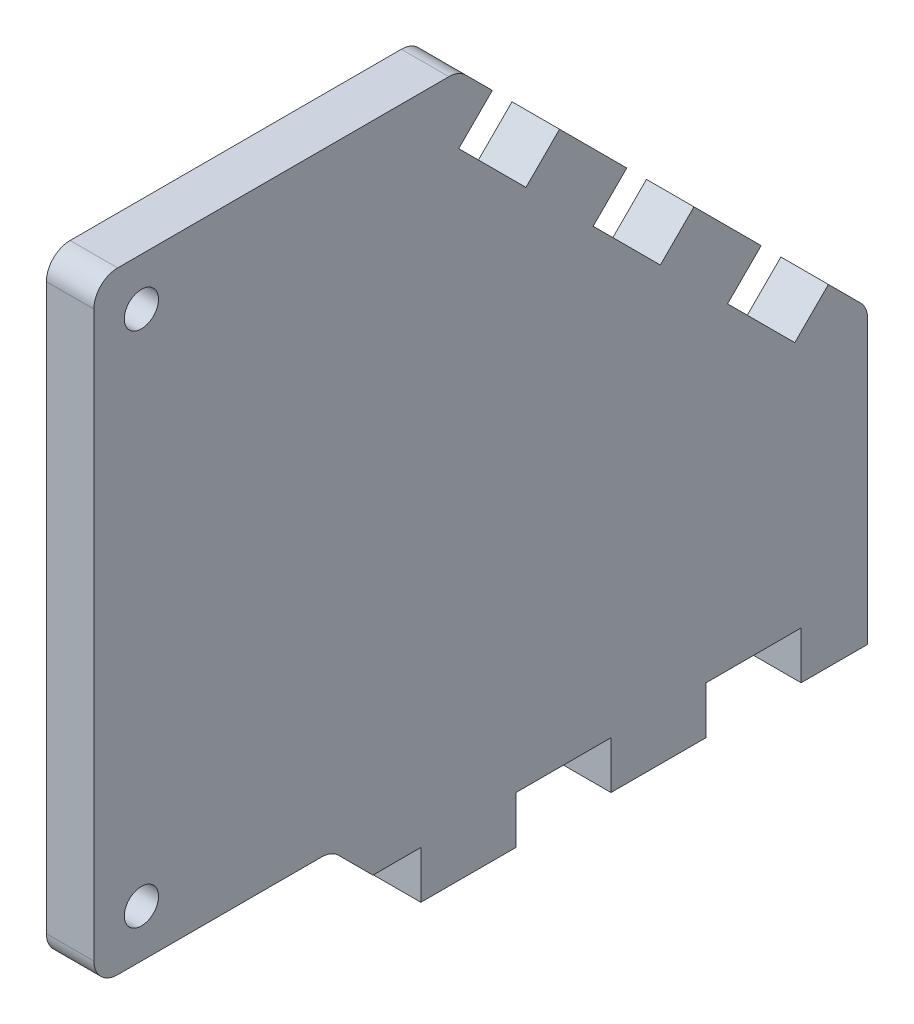
ISO-10303-21;
HEADER;
FILE_DESCRIPTION(('STEP AP214'),'2;1');
FILE_NAME('part.step','',(''),(''),'','','');
FILE_SCHEMA(('AUTOMOTIVE_DESIGN { 1 0 10303 214 1 1 1 1 }'));
ENDSEC;
DATA;
#1=APPLICATION_CONTEXT('core data for automotive mechanical design processes');
#2=APPLICATION_PROTOCOL_DEFINITION('international standard','automotive_design',2000,#1);
#3=PRODUCT_CONTEXT('',#1,'mechanical');
#4=PRODUCT('Part','Part','',(#3));
#5=PRODUCT_RELATED_PRODUCT_CATEGORY('part','',(#4));
#6=PRODUCT_DEFINITION_FORMATION('','',#4);
#7=PRODUCT_DEFINITION_CONTEXT('part definition',#1,'design');
#8=PRODUCT_DEFINITION('design','',#6,#7);
#9=PRODUCT_DEFINITION_SHAPE('','',#8);
#10=(LENGTH_UNIT() NAMED_UNIT(*) SI_UNIT(.MILLI.,.METRE.));
#11=(NAMED_UNIT(*) PLANE_ANGLE_UNIT() SI_UNIT($,.RADIAN.));
#12=(NAMED_UNIT(*) SI_UNIT($,.STERADIAN.) SOLID_ANGLE_UNIT());
#13=UNCERTAINTY_MEASURE_WITH_UNIT(LENGTH_MEASURE(1.E-05),#10,'distance_accuracy_value','');
#14=(GEOMETRIC_REPRESENTATION_CONTEXT(3) GLOBAL_UNCERTAINTY_ASSIGNED_CONTEXT((#13)) GLOBAL_UNIT_ASSIGNED_CONTEXT((#10,
#11,#12)) REPRESENTATION_CONTEXT('',''));
#15=CARTESIAN_POINT('',(0.,0.,0.));
#16=DIRECTION('',(0.,0.,1.));
#17=DIRECTION('',(1.,0.,0.));
#18=AXIS2_PLACEMENT_3D('',#15,#16,#17);
#19=CARTESIAN_POINT('',(6.35,41.2634086658808,-41.2634086658803));
#20=DIRECTION('',(0.,0.707106781186552,-0.707106781186543));
#21=DIRECTION('',(0.,0.707106781186543,0.707106781186552));
#22=AXIS2_PLACEMENT_3D('',#19,#20,#21);
#23=PLANE('',#22);
#24=DIRECTION('',(1.,0.,0.));
#25=VECTOR('',#24,1.);
#26=CARTESIAN_POINT('',(0.,88.1296158183963,5.60279848663597));
#27=LINE('',#26,#25);
#28=CARTESIAN_POINT('',(0.,88.1296158183963,5.60279848663597));
#29=VERTEX_POINT('',#28);
#30=CARTESIAN_POINT('',(6.35,88.1296158183963,5.60279848663597));
#31=VERTEX_POINT('',#30);
#32=EDGE_CURVE('E434',#29,#31,#27,.T.);
#33=ORIENTED_EDGE('',*,*,#32,.T.);
#34=DIRECTION('',(0.,-0.707106781186543,-0.707106781186552));
#35=VECTOR('',#34,1.);
#36=CARTESIAN_POINT('',(6.35,41.2634086658808,-41.2634086658803));
#37=LINE('',#36,#35);
#38=CARTESIAN_POINT('',(6.35,79.1493596973271,-3.37745763443318));
#39=VERTEX_POINT('',#38);
#40=EDGE_CURVE('E310',#31,#39,#37,.T.);
#41=ORIENTED_EDGE('',*,*,#40,.T.);
#42=DIRECTION('',(1.,0.,0.));
#43=VECTOR('',#42,1.);
#44=CARTESIAN_POINT('',(0.,79.1493596973271,-3.37745763443318));
#45=LINE('',#44,#43);
#46=CARTESIAN_POINT('',(0.,79.1493596973271,-3.37745763443318));
#47=VERTEX_POINT('',#46);
#48=EDGE_CURVE('E415',#47,#39,#45,.T.);
#49=ORIENTED_EDGE('',*,*,#48,.F.);
#50=DIRECTION('',(0.,-0.707106781186543,-0.707106781186552));
#51=VECTOR('',#50,1.);
#52=CARTESIAN_POINT('',(0.,41.2634086658808,-41.2634086658803));
#53=LINE('',#52,#51);
#54=EDGE_CURVE('E564',#29,#47,#53,.T.);
#55=ORIENTED_EDGE('',*,*,#54,.F.);
#56=EDGE_LOOP('',(#33,#41,#49,#55));
#57=FACE_BOUND('',#56,.T.);
#58=ADVANCED_FACE('F35',(#57),#23,.T.);
#59=DIRECTION('',(1.,0.,0.));
#60=VECTOR('',#59,1.);
#61=CARTESIAN_POINT('',(0.,70.169103576258,-12.3577137555023));
#62=LINE('',#61,#60);
#63=CARTESIAN_POINT('',(0.,70.169103576258,-12.3577137555023));
#64=VERTEX_POINT('',#63);
#65=CARTESIAN_POINT('',(6.35,70.169103576258,-12.3577137555023));
#66=VERTEX_POINT('',#65);
#67=EDGE_CURVE('E407',#64,#66,#62,.T.);
#68=ORIENTED_EDGE('',*,*,#67,.T.);
#69=CARTESIAN_POINT('',(6.35,61.1888474551889,-21.3379698765714));
#70=VERTEX_POINT('',#69);
#71=EDGE_CURVE('E613',#66,#70,#37,.T.);
#72=ORIENTED_EDGE('',*,*,#71,.T.);
#73=DIRECTION('',(1.,0.,0.));
#74=VECTOR('',#73,1.);
#75=CARTESIAN_POINT('',(0.,61.1888474551889,-21.3379698765714));
#76=LINE('',#75,#74);
#77=CARTESIAN_POINT('',(0.,61.1888474551889,-21.3379698765714));
#78=VERTEX_POINT('',#77);
#79=EDGE_CURVE('E388',#78,#70,#76,.T.);
#80=ORIENTED_EDGE('',*,*,#79,.F.);
#81=EDGE_CURVE('E631',#64,#78,#53,.T.);
#82=ORIENTED_EDGE('',*,*,#81,.F.);
#83=EDGE_LOOP('',(#68,#72,#80,#82));
#84=FACE_BOUND('',#83,.T.);
#85=ADVANCED_FACE('F589',(#84),#23,.T.);
#86=CARTESIAN_POINT('',(6.35,52.2085913341197,-30.3182259976406));
#87=VERTEX_POINT('',#86);
#88=CARTESIAN_POINT('',(6.35,47.8967533014937,-34.6300640302673));
#89=VERTEX_POINT('',#88);
#90=EDGE_CURVE('E311',#87,#89,#37,.T.);
#91=ORIENTED_EDGE('',*,*,#90,.T.);
#92=DIRECTION('',(1.,0.,0.));
#93=VECTOR('',#92,1.);
#94=CARTESIAN_POINT('',(0.,47.8967533014937,-34.6300640302673));
#95=LINE('',#94,#93);
#96=CARTESIAN_POINT('',(0.,47.8967533014937,-34.6300640302673));
#97=VERTEX_POINT('',#96);
#98=EDGE_CURVE('E477',#89,#97,#95,.F.);
#99=ORIENTED_EDGE('',*,*,#98,.T.);
#100=CARTESIAN_POINT('',(0.,52.2085913341197,-30.3182259976406));
#101=VERTEX_POINT('',#100);
#102=EDGE_CURVE('E566',#101,#97,#53,.T.);
#103=ORIENTED_EDGE('',*,*,#102,.F.);
#104=DIRECTION('',(1.,0.,0.));
#105=VECTOR('',#104,1.);
#106=CARTESIAN_POINT('',(0.,52.2085913341197,-30.3182259976406));
#107=LINE('',#106,#105);
#108=EDGE_CURVE('E380',#101,#87,#107,.T.);
#109=ORIENTED_EDGE('',*,*,#108,.T.);
#110=EDGE_LOOP('',(#91,#99,#103,#109));
#111=FACE_BOUND('',#110,.T.);
#112=ADVANCED_FACE('F596',(#111),#23,.T.);
#113=CARTESIAN_POINT('',(6.35,7.9375,0.));
#114=DIRECTION('',(0.,-1.,0.));
#115=DIRECTION('',(0.,0.,-1.));
#116=AXIS2_PLACEMENT_3D('',#113,#114,#115);
#117=PLANE('',#116);
#118=DIRECTION('',(1.,0.,0.));
#119=VECTOR('',#118,1.);
#120=CARTESIAN_POINT('',(0.,7.93750000000001,-13.97));
#121=LINE('',#120,#119);
#122=CARTESIAN_POINT('',(0.,7.93750000000001,-13.97));
#123=VERTEX_POINT('',#122);
#124=CARTESIAN_POINT('',(6.35,7.93750000000001,-13.97));
#125=VERTEX_POINT('',#124);
#126=EDGE_CURVE('E356',#123,#125,#121,.T.);
#127=ORIENTED_EDGE('',*,*,#126,.T.);
#128=DIRECTION('',(0.,0.,1.));
#129=VECTOR('',#128,1.);
#130=CARTESIAN_POINT('',(6.35,7.9375,0.));
#131=LINE('',#130,#129);
#132=CARTESIAN_POINT('',(6.35,7.93750000000001,-1.27000000000002));
#133=VERTEX_POINT('',#132);
#134=EDGE_CURVE('E282',#125,#133,#131,.T.);
#135=ORIENTED_EDGE('',*,*,#134,.T.);
#136=DIRECTION('',(1.,0.,0.));
#137=VECTOR('',#136,1.);
#138=CARTESIAN_POINT('',(0.,7.93750000000001,-1.27000000000002));
#139=LINE('',#138,#137);
#140=CARTESIAN_POINT('',(0.,7.93750000000001,-1.27000000000002));
#141=VERTEX_POINT('',#140);
#142=EDGE_CURVE('E333',#141,#133,#139,.T.);
#143=ORIENTED_EDGE('',*,*,#142,.F.);
#144=DIRECTION('',(0.,0.,1.));
#145=VECTOR('',#144,1.);
#146=CARTESIAN_POINT('',(0.,7.9375,0.));
#147=LINE('',#146,#145);
#148=EDGE_CURVE('E540',#123,#141,#147,.T.);
#149=ORIENTED_EDGE('',*,*,#148,.F.);
#150=EDGE_LOOP('',(#127,#135,#143,#149));
#151=FACE_BOUND('',#150,.T.);
#152=ADVANCED_FACE('F584',(#151),#117,.T.);
#153=DIRECTION('',(1.,0.,0.));
#154=VECTOR('',#153,1.);
#155=CARTESIAN_POINT('',(0.,7.9375,-35.56));
#156=LINE('',#155,#154);
#157=CARTESIAN_POINT('',(0.,7.93750000000001,-35.56));
#158=VERTEX_POINT('',#157);
#159=CARTESIAN_POINT('',(6.35,7.9375,-35.56));
#160=VERTEX_POINT('',#159);
#161=EDGE_CURVE('E260',#158,#160,#156,.T.);
#162=ORIENTED_EDGE('',*,*,#161,.T.);
#163=CARTESIAN_POINT('',(6.35,7.93750000000001,-26.67));
#164=VERTEX_POINT('',#163);
#165=EDGE_CURVE('E271',#160,#164,#131,.T.);
#166=ORIENTED_EDGE('',*,*,#165,.T.);
#167=DIRECTION('',(1.,0.,0.));
#168=VECTOR('',#167,1.);
#169=CARTESIAN_POINT('',(0.,7.93750000000001,-26.67));
#170=LINE('',#169,#168);
#171=CARTESIAN_POINT('',(0.,7.93750000000001,-26.67));
#172=VERTEX_POINT('',#171);
#173=EDGE_CURVE('E364',#172,#164,#170,.T.);
#174=ORIENTED_EDGE('',*,*,#173,.F.);
#175=EDGE_CURVE('E273',#158,#172,#147,.T.);
#176=ORIENTED_EDGE('',*,*,#175,.F.);
#177=EDGE_LOOP('',(#162,#166,#174,#176));
#178=FACE_BOUND('',#177,.T.);
#179=ADVANCED_FACE('F269',(#178),#117,.T.);
#180=CARTESIAN_POINT('',(0.,100.670064030267,18.143246698507));
#181=VERTEX_POINT('',#180);
#182=CARTESIAN_POINT('',(0.,97.1098719394654,14.5830546077051));
#183=VERTEX_POINT('',#182);
#184=EDGE_CURVE('E561',#181,#183,#53,.T.);
#185=ORIENTED_EDGE('',*,*,#184,.F.);
#186=DIRECTION('',(-1.,0.,0.));
#187=VECTOR('',#186,1.);
#188=CARTESIAN_POINT('',(6.35,100.670064030267,18.143246698507));
#189=LINE('',#188,#187);
#190=CARTESIAN_POINT('',(6.35,100.670064030267,18.143246698507));
#191=VERTEX_POINT('',#190);
#192=EDGE_CURVE('E497',#181,#191,#189,.F.);
#193=ORIENTED_EDGE('',*,*,#192,.T.);
#194=CARTESIAN_POINT('',(6.35,97.1098719394654,14.5830546077051));
#195=VERTEX_POINT('',#194);
#196=EDGE_CURVE('E308',#191,#195,#37,.T.);
#197=ORIENTED_EDGE('',*,*,#196,.T.);
#198=DIRECTION('',(1.,0.,0.));
#199=VECTOR('',#198,1.);
#200=CARTESIAN_POINT('',(0.,97.1098719394654,14.5830546077051));
#201=LINE('',#200,#199);
#202=EDGE_CURVE('E442',#183,#195,#201,.T.);
#203=ORIENTED_EDGE('',*,*,#202,.F.);
#204=EDGE_LOOP('',(#185,#193,#197,#203));
#205=FACE_BOUND('',#204,.T.);
#206=ADVANCED_FACE('F592',(#205),#23,.T.);
#207=CARTESIAN_POINT('',(6.35,101.6,0.));
#208=DIRECTION('',(0.,1.,0.));
#209=DIRECTION('',(0.,0.,1.));
#210=AXIS2_PLACEMENT_3D('',#207,#208,#209);
#211=PLANE('',#210);
#212=DIRECTION('',(0.,0.,-1.));
#213=VECTOR('',#212,1.);
#214=CARTESIAN_POINT('',(6.35,101.6,0.));
#215=LINE('',#214,#213);
#216=CARTESIAN_POINT('',(6.35,101.6,64.643));
#217=VERTEX_POINT('',#216);
#218=CARTESIAN_POINT('',(6.35,101.6,20.3883107287743));
#219=VERTEX_POINT('',#218);
#220=EDGE_CURVE('E305',#217,#219,#215,.T.);
#221=ORIENTED_EDGE('',*,*,#220,.T.);
#222=DIRECTION('',(-1.,0.,0.));
#223=VECTOR('',#222,1.);
#224=CARTESIAN_POINT('',(6.35,101.6,20.3883107287743));
#225=LINE('',#224,#223);
#226=CARTESIAN_POINT('',(0.,101.6,20.3883107287743));
#227=VERTEX_POINT('',#226);
#228=EDGE_CURVE('E495',#219,#227,#225,.T.);
#229=ORIENTED_EDGE('',*,*,#228,.T.);
#230=DIRECTION('',(0.,0.,-1.));
#231=VECTOR('',#230,1.);
#232=CARTESIAN_POINT('',(0.,101.6,0.));
#233=LINE('',#232,#231);
#234=CARTESIAN_POINT('',(0.,101.6,64.643));
#235=VERTEX_POINT('',#234);
#236=EDGE_CURVE('E558',#235,#227,#233,.T.);
#237=ORIENTED_EDGE('',*,*,#236,.F.);
#238=DIRECTION('',(-1.,0.,0.));
#239=VECTOR('',#238,1.);
#240=CARTESIAN_POINT('',(6.35,101.6,64.643));
#241=LINE('',#240,#239);
#242=EDGE_CURVE('E493',#235,#217,#241,.F.);
#243=ORIENTED_EDGE('',*,*,#242,.T.);
#244=EDGE_LOOP('',(#221,#229,#237,#243));
#245=FACE_BOUND('',#244,.T.);
#246=ADVANCED_FACE('F560',(#245),#211,.T.);
#247=CARTESIAN_POINT('',(6.35,0.,67.818));
#248=DIRECTION('',(0.,0.,-1.));
#249=DIRECTION('',(0.,1.,0.));
#250=AXIS2_PLACEMENT_3D('',#247,#248,#249);
#251=PLANE('',#250);
#252=DIRECTION('',(0.,-1.,0.));
#253=VECTOR('',#252,1.);
#254=CARTESIAN_POINT('',(6.35,0.,67.818));
#255=LINE('',#254,#253);
#256=CARTESIAN_POINT('',(6.35,98.425,67.818));
#257=VERTEX_POINT('',#256);
#258=CARTESIAN_POINT('',(6.35,22.987,67.818));
#259=VERTEX_POINT('',#258);
#260=EDGE_CURVE('E300',#257,#259,#255,.T.);
#261=ORIENTED_EDGE('',*,*,#260,.F.);
#262=DIRECTION('',(-1.,0.,0.));
#263=VECTOR('',#262,1.);
#264=CARTESIAN_POINT('',(0.,98.425,67.818));
#265=LINE('',#264,#263);
#266=CARTESIAN_POINT('',(0.,98.425,67.818));
#267=VERTEX_POINT('',#266);
#268=EDGE_CURVE('E509',#257,#267,#265,.T.);
#269=ORIENTED_EDGE('',*,*,#268,.T.);
#270=DIRECTION('',(0.,-1.,0.));
#271=VECTOR('',#270,1.);
#272=CARTESIAN_POINT('',(0.,0.,67.818));
#273=LINE('',#272,#271);
#274=CARTESIAN_POINT('',(0.,22.987,67.818));
#275=VERTEX_POINT('',#274);
#276=EDGE_CURVE('E523',#267,#275,#273,.T.);
#277=ORIENTED_EDGE('',*,*,#276,.T.);
#278=DIRECTION('',(-1.,0.,0.));
#279=VECTOR('',#278,1.);
#280=CARTESIAN_POINT('',(6.35,22.987,67.818));
#281=LINE('',#280,#279);
#282=EDGE_CURVE('E507',#275,#259,#281,.F.);
#283=ORIENTED_EDGE('',*,*,#282,.T.);
#284=EDGE_LOOP('',(#261,#269,#277,#283));
#285=FACE_BOUND('',#284,.T.);
#286=ADVANCED_FACE('F552',(#285),#251,.F.);
#287=CARTESIAN_POINT('',(6.35,19.812,0.));
#288=DIRECTION('',(0.,1.,0.));
#289=DIRECTION('',(0.,0.,1.));
#290=AXIS2_PLACEMENT_3D('',#287,#288,#289);
#291=PLANE('',#290);
#292=DIRECTION('',(0.,0.,-1.));
#293=VECTOR('',#292,1.);
#294=CARTESIAN_POINT('',(0.,19.812,0.));
#295=LINE('',#294,#293);
#296=CARTESIAN_POINT('',(0.,19.812,64.643));
#297=VERTEX_POINT('',#296);
#298=CARTESIAN_POINT('',(0.,19.812,37.3831280605345));
#299=VERTEX_POINT('',#298);
#300=EDGE_CURVE('E514',#297,#299,#295,.T.);
#301=ORIENTED_EDGE('',*,*,#300,.T.);
#302=DIRECTION('',(-1.,0.,0.));
#303=VECTOR('',#302,1.);
#304=CARTESIAN_POINT('',(6.35,19.812,37.3831280605345));
#305=LINE('',#304,#303);
#306=CARTESIAN_POINT('',(6.35,19.812,37.3831280605345));
#307=VERTEX_POINT('',#306);
#308=EDGE_CURVE('E505',#299,#307,#305,.F.);
#309=ORIENTED_EDGE('',*,*,#308,.T.);
#310=DIRECTION('',(0.,0.,-1.));
#311=VECTOR('',#310,1.);
#312=CARTESIAN_POINT('',(6.35,19.812,0.));
#313=LINE('',#312,#311);
#314=CARTESIAN_POINT('',(6.35,19.812,64.643));
#315=VERTEX_POINT('',#314);
#316=EDGE_CURVE('E295',#315,#307,#313,.T.);
#317=ORIENTED_EDGE('',*,*,#316,.F.);
#318=DIRECTION('',(-1.,0.,0.));
#319=VECTOR('',#318,1.);
#320=CARTESIAN_POINT('',(6.35,19.812,64.643));
#321=LINE('',#320,#319);
#322=EDGE_CURVE('E502',#315,#297,#321,.T.);
#323=ORIENTED_EDGE('',*,*,#322,.T.);
#324=EDGE_LOOP('',(#301,#309,#317,#323));
#325=FACE_BOUND('',#324,.T.);
#326=ADVANCED_FACE('F520',(#325),#291,.F.);
#327=CARTESIAN_POINT('',(6.35,-8.12799999999986,8.12799999999976));
#328=DIRECTION('',(0.,0.707106781186552,-0.707106781186543));
#329=DIRECTION('',(0.,0.707106781186543,0.707106781186552));
#330=AXIS2_PLACEMENT_3D('',#327,#328,#329);
#331=PLANE('',#330);
#332=DIRECTION('',(0.,-0.707106781186543,-0.707106781186552));
#333=VECTOR('',#332,1.);
#334=CARTESIAN_POINT('',(6.35,-8.12799999999986,8.12799999999976));
#335=LINE('',#334,#333);
#336=CARTESIAN_POINT('',(6.35,18.8820640302673,35.1380640302673));
#337=VERTEX_POINT('',#336);
#338=CARTESIAN_POINT('',(6.35,14.2874999999999,30.5434999999998));
#339=VERTEX_POINT('',#338);
#340=EDGE_CURVE('E289',#337,#339,#335,.T.);
#341=ORIENTED_EDGE('',*,*,#340,.F.);
#342=DIRECTION('',(-1.,0.,0.));
#343=VECTOR('',#342,1.);
#344=CARTESIAN_POINT('',(0.,18.8820640302673,35.1380640302673));
#345=LINE('',#344,#343);
#346=CARTESIAN_POINT('',(0.,18.8820640302673,35.1380640302673));
#347=VERTEX_POINT('',#346);
#348=EDGE_CURVE('E499',#337,#347,#345,.T.);
#349=ORIENTED_EDGE('',*,*,#348,.T.);
#350=DIRECTION('',(0.,-0.707106781186543,-0.707106781186552));
#351=VECTOR('',#350,1.);
#352=CARTESIAN_POINT('',(0.,-8.12799999999986,8.12799999999976));
#353=LINE('',#352,#351);
#354=CARTESIAN_POINT('',(0.,14.2874999999999,30.5434999999998));
#355=VERTEX_POINT('',#354);
#356=EDGE_CURVE('E515',#347,#355,#353,.T.);
#357=ORIENTED_EDGE('',*,*,#356,.T.);
#358=DIRECTION('',(1.,0.,0.));
#359=VECTOR('',#358,1.);
#360=CARTESIAN_POINT('',(6.35,14.2874999999999,30.5434999999998));
#361=LINE('',#360,#359);
#362=EDGE_CURVE('E318',#355,#339,#361,.T.);
#363=ORIENTED_EDGE('',*,*,#362,.T.);
#364=EDGE_LOOP('',(#341,#349,#357,#363));
#365=FACE_BOUND('',#364,.T.);
#366=ADVANCED_FACE('F528',(#365),#331,.F.);
#367=CARTESIAN_POINT('',(6.35,95.25,61.468));
#368=DIRECTION('',(-1.,0.,0.));
#369=DIRECTION('',(0.,0.,1.));
#370=AXIS2_PLACEMENT_3D('',#367,#368,#369);
#371=CYLINDRICAL_SURFACE('',#370,2.28599999999999);
#372=CARTESIAN_POINT('',(6.35,95.25,61.468));
#373=DIRECTION('',(1.,0.,0.));
#374=DIRECTION('',(0.,0.,-1.));
#375=AXIS2_PLACEMENT_3D('',#372,#373,#374);
#376=CIRCLE('',#375,2.28599999999999);
#377=CARTESIAN_POINT('',(6.35,95.25,59.182));
#378=VERTEX_POINT('',#377);
#379=EDGE_CURVE('E312',#378,#378,#376,.T.);
#380=ORIENTED_EDGE('',*,*,#379,.T.);
#381=EDGE_LOOP('',(#380));
#382=FACE_BOUND('',#381,.T.);
#383=CARTESIAN_POINT('',(0.,95.25,61.468));
#384=DIRECTION('',(1.,0.,0.));
#385=DIRECTION('',(0.,0.,-1.));
#386=AXIS2_PLACEMENT_3D('',#383,#384,#385);
#387=CIRCLE('',#386,2.28599999999999);
#388=CARTESIAN_POINT('',(0.,95.25,59.182));
#389=VERTEX_POINT('',#388);
#390=EDGE_CURVE('E568',#389,#389,#387,.T.);
#391=ORIENTED_EDGE('',*,*,#390,.F.);
#392=EDGE_LOOP('',(#391));
#393=FACE_BOUND('',#392,.T.);
#394=ADVANCED_FACE('F576',(#382,#393),#371,.F.);
#395=CARTESIAN_POINT('',(6.35,26.162,61.468));
#396=DIRECTION('',(-1.,0.,0.));
#397=DIRECTION('',(0.,0.,1.));
#398=AXIS2_PLACEMENT_3D('',#395,#396,#397);
#399=CYLINDRICAL_SURFACE('',#398,2.28599999999999);
#400=CARTESIAN_POINT('',(6.35,26.162,61.468));
#401=DIRECTION('',(1.,0.,0.));
#402=DIRECTION('',(0.,0.,-1.));
#403=AXIS2_PLACEMENT_3D('',#400,#401,#402);
#404=CIRCLE('',#403,2.28599999999999);
#405=CARTESIAN_POINT('',(6.35,26.162,59.182));
#406=VERTEX_POINT('',#405);
#407=EDGE_CURVE('E315',#406,#406,#404,.T.);
#408=ORIENTED_EDGE('',*,*,#407,.T.);
#409=EDGE_LOOP('',(#408));
#410=FACE_BOUND('',#409,.T.);
#411=CARTESIAN_POINT('',(0.,26.162,61.468));
#412=DIRECTION('',(1.,0.,0.));
#413=DIRECTION('',(0.,0.,-1.));
#414=AXIS2_PLACEMENT_3D('',#411,#412,#413);
#415=CIRCLE('',#414,2.28599999999999);
#416=CARTESIAN_POINT('',(0.,26.162,59.182));
#417=VERTEX_POINT('',#416);
#418=EDGE_CURVE('E321',#417,#417,#415,.T.);
#419=ORIENTED_EDGE('',*,*,#418,.F.);
#420=EDGE_LOOP('',(#419));
#421=FACE_BOUND('',#420,.T.);
#422=ADVANCED_FACE('F574',(#410,#421),#399,.F.);
#423=DIRECTION('',(1.,0.,0.));
#424=VECTOR('',#423,1.);
#425=CARTESIAN_POINT('',(0.,7.93750000000001,11.43));
#426=LINE('',#425,#424);
#427=CARTESIAN_POINT('',(0.,7.93750000000001,11.43));
#428=VERTEX_POINT('',#427);
#429=CARTESIAN_POINT('',(6.35,7.93750000000001,11.43));
#430=VERTEX_POINT('',#429);
#431=EDGE_CURVE('E343',#428,#430,#426,.T.);
#432=ORIENTED_EDGE('',*,*,#431,.T.);
#433=CARTESIAN_POINT('',(6.35,7.93750000000001,24.13));
#434=VERTEX_POINT('',#433);
#435=EDGE_CURVE('E284',#430,#434,#131,.T.);
#436=ORIENTED_EDGE('',*,*,#435,.T.);
#437=DIRECTION('',(1.,0.,0.));
#438=VECTOR('',#437,1.);
#439=CARTESIAN_POINT('',(0.,7.93750000000001,24.13));
#440=LINE('',#439,#438);
#441=CARTESIAN_POINT('',(0.,7.93750000000001,24.13));
#442=VERTEX_POINT('',#441);
#443=EDGE_CURVE('E323',#442,#434,#440,.T.);
#444=ORIENTED_EDGE('',*,*,#443,.F.);
#445=EDGE_CURVE('E535',#428,#442,#147,.T.);
#446=ORIENTED_EDGE('',*,*,#445,.F.);
#447=EDGE_LOOP('',(#432,#436,#444,#446));
#448=FACE_BOUND('',#447,.T.);
#449=ADVANCED_FACE('F539',(#448),#117,.T.);
#450=CARTESIAN_POINT('',(6.35,0.,0.));
#451=DIRECTION('',(1.,0.,0.));
#452=DIRECTION('',(0.,0.,-1.));
#453=AXIS2_PLACEMENT_3D('',#450,#451,#452);
#454=PLANE('',#453);
#455=DIRECTION('',(0.,-1.,0.));
#456=VECTOR('',#455,1.);
#457=CARTESIAN_POINT('',(6.35,7.9375,-35.56));
#458=LINE('',#457,#456);
#459=CARTESIAN_POINT('',(6.35,45.6516892712264,-35.56));
#460=VERTEX_POINT('',#459);
#461=EDGE_CURVE('E256',#460,#160,#458,.T.);
#462=ORIENTED_EDGE('',*,*,#461,.F.);
#463=CARTESIAN_POINT('',(6.35,45.6516892712264,-32.385));
#464=DIRECTION('',(1.,0.,0.));
#465=DIRECTION('',(0.,0.,-1.));
#466=AXIS2_PLACEMENT_3D('',#463,#464,#465);
#467=CIRCLE('',#466,3.175);
#468=EDGE_CURVE('E476',#460,#89,#467,.T.);
#469=ORIENTED_EDGE('',*,*,#468,.T.);
#470=ORIENTED_EDGE('',*,*,#90,.F.);
#471=DIRECTION('',(0.,0.707106781186548,-0.707106781186548));
#472=VECTOR('',#471,1.);
#473=CARTESIAN_POINT('',(6.35,52.2085913341197,-30.3182259976406));
#474=LINE('',#473,#472);
#475=CARTESIAN_POINT('',(6.35,47.7184632735851,-25.828097937106));
#476=VERTEX_POINT('',#475);
#477=EDGE_CURVE('E398',#476,#87,#474,.T.);
#478=ORIENTED_EDGE('',*,*,#477,.F.);
#479=DIRECTION('',(0.,-0.707106781186548,-0.707106781186547));
#480=VECTOR('',#479,1.);
#481=CARTESIAN_POINT('',(6.35,47.7184632735851,-25.828097937106));
#482=LINE('',#481,#480);
#483=CARTESIAN_POINT('',(6.35,56.6987193946543,-16.8478418160368));
#484=VERTEX_POINT('',#483);
#485=EDGE_CURVE('E401',#484,#476,#482,.T.);
#486=ORIENTED_EDGE('',*,*,#485,.F.);
#487=DIRECTION('',(0.,-0.707106781186548,0.707106781186547));
#488=VECTOR('',#487,1.);
#489=CARTESIAN_POINT('',(6.35,56.6987193946543,-16.8478418160368));
#490=LINE('',#489,#488);
#491=EDGE_CURVE('E404',#70,#484,#490,.T.);
#492=ORIENTED_EDGE('',*,*,#491,.F.);
#493=ORIENTED_EDGE('',*,*,#71,.F.);
#494=DIRECTION('',(0.,0.707106781186548,-0.707106781186548));
#495=VECTOR('',#494,1.);
#496=CARTESIAN_POINT('',(6.35,70.169103576258,-12.3577137555023));
#497=LINE('',#496,#495);
#498=CARTESIAN_POINT('',(6.35,65.6789755157234,-7.86758569496774));
#499=VERTEX_POINT('',#498);
#500=EDGE_CURVE('E425',#499,#66,#497,.T.);
#501=ORIENTED_EDGE('',*,*,#500,.F.);
#502=DIRECTION('',(0.,-0.707106781186547,-0.707106781186548));
#503=VECTOR('',#502,1.);
#504=CARTESIAN_POINT('',(6.35,65.6789755157234,-7.86758569496774));
#505=LINE('',#504,#503);
#506=CARTESIAN_POINT('',(6.35,74.6592316367925,1.11267042610141));
#507=VERTEX_POINT('',#506);
#508=EDGE_CURVE('E428',#507,#499,#505,.T.);
#509=ORIENTED_EDGE('',*,*,#508,.F.);
#510=DIRECTION('',(0.,-0.707106781186547,0.707106781186548));
#511=VECTOR('',#510,1.);
#512=CARTESIAN_POINT('',(6.35,74.6592316367925,1.11267042610141));
#513=LINE('',#512,#511);
#514=EDGE_CURVE('E431',#39,#507,#513,.T.);
#515=ORIENTED_EDGE('',*,*,#514,.F.);
#516=ORIENTED_EDGE('',*,*,#40,.F.);
#517=DIRECTION('',(0.,0.707106781186548,-0.707106781186547));
#518=VECTOR('',#517,1.);
#519=CARTESIAN_POINT('',(6.35,88.1296158183963,5.60279848663597));
#520=LINE('',#519,#518);
#521=CARTESIAN_POINT('',(6.35,83.6394877578617,10.0929265471706));
#522=VERTEX_POINT('',#521);
#523=EDGE_CURVE('E452',#522,#31,#520,.T.);
#524=ORIENTED_EDGE('',*,*,#523,.F.);
#525=DIRECTION('',(0.,-0.707106781186548,-0.707106781186547));
#526=VECTOR('',#525,1.);
#527=CARTESIAN_POINT('',(6.35,83.6394877578617,10.0929265471706));
#528=LINE('',#527,#526);
#529=CARTESIAN_POINT('',(6.35,92.6197438789308,19.0731826682397));
#530=VERTEX_POINT('',#529);
#531=EDGE_CURVE('E455',#530,#522,#528,.T.);
#532=ORIENTED_EDGE('',*,*,#531,.F.);
#533=DIRECTION('',(0.,-0.707106781186546,0.707106781186549));
#534=VECTOR('',#533,1.);
#535=CARTESIAN_POINT('',(6.35,92.6197438789308,19.0731826682397));
#536=LINE('',#535,#534);
#537=EDGE_CURVE('E274',#195,#530,#536,.T.);
#538=ORIENTED_EDGE('',*,*,#537,.F.);
#539=ORIENTED_EDGE('',*,*,#196,.F.);
#540=CARTESIAN_POINT('',(6.35,98.425,20.3883107287743));
#541=DIRECTION('',(1.,0.,0.));
#542=DIRECTION('',(0.,0.,-1.));
#543=AXIS2_PLACEMENT_3D('',#540,#541,#542);
#544=CIRCLE('',#543,3.175);
#545=EDGE_CURVE('E480',#191,#219,#544,.T.);
#546=ORIENTED_EDGE('',*,*,#545,.T.);
#547=ORIENTED_EDGE('',*,*,#220,.F.);
#548=CARTESIAN_POINT('',(6.35,98.425,64.643));
#549=DIRECTION('',(1.,0.,0.));
#550=DIRECTION('',(0.,0.,-1.));
#551=AXIS2_PLACEMENT_3D('',#548,#549,#550);
#552=CIRCLE('',#551,3.175);
#553=EDGE_CURVE('E484',#217,#257,#552,.T.);
#554=ORIENTED_EDGE('',*,*,#553,.T.);
#555=ORIENTED_EDGE('',*,*,#260,.T.);
#556=CARTESIAN_POINT('',(6.35,22.987,64.643));
#557=DIRECTION('',(1.,0.,0.));
#558=DIRECTION('',(0.,0.,-1.));
#559=AXIS2_PLACEMENT_3D('',#556,#557,#558);
#560=CIRCLE('',#559,3.175);
#561=EDGE_CURVE('E285',#259,#315,#560,.T.);
#562=ORIENTED_EDGE('',*,*,#561,.T.);
#563=ORIENTED_EDGE('',*,*,#316,.T.);
#564=CARTESIAN_POINT('',(6.35,16.637,37.3831280605345));
#565=DIRECTION('',(1.,0.,0.));
#566=DIRECTION('',(0.,0.,-1.));
#567=AXIS2_PLACEMENT_3D('',#564,#565,#566);
#568=CIRCLE('',#567,3.175);
#569=EDGE_CURVE('E11',#307,#337,#568,.F.);
#570=ORIENTED_EDGE('',*,*,#569,.T.);
#571=ORIENTED_EDGE('',*,*,#340,.T.);
#572=DIRECTION('',(0.,0.,1.));
#573=VECTOR('',#572,1.);
#574=CARTESIAN_POINT('',(6.35,14.2874999999999,36.83));
#575=LINE('',#574,#573);
#576=CARTESIAN_POINT('',(6.35,14.2874999999999,24.13));
#577=VERTEX_POINT('',#576);
#578=EDGE_CURVE('E327',#577,#339,#575,.T.);
#579=ORIENTED_EDGE('',*,*,#578,.F.);
#580=DIRECTION('',(0.,1.,0.));
#581=VECTOR('',#580,1.);
#582=CARTESIAN_POINT('',(6.35,14.2874999999999,24.13));
#583=LINE('',#582,#581);
#584=EDGE_CURVE('E330',#434,#577,#583,.T.);
#585=ORIENTED_EDGE('',*,*,#584,.F.);
#586=ORIENTED_EDGE('',*,*,#435,.F.);
#587=DIRECTION('',(0.,-1.,0.));
#588=VECTOR('',#587,1.);
#589=CARTESIAN_POINT('',(6.35,7.93750000000001,11.43));
#590=LINE('',#589,#588);
#591=CARTESIAN_POINT('',(6.35,14.2875,11.43));
#592=VERTEX_POINT('',#591);
#593=EDGE_CURVE('E347',#592,#430,#590,.T.);
#594=ORIENTED_EDGE('',*,*,#593,.F.);
#595=DIRECTION('',(0.,0.,1.));
#596=VECTOR('',#595,1.);
#597=CARTESIAN_POINT('',(6.35,14.2875,11.43));
#598=LINE('',#597,#596);
#599=CARTESIAN_POINT('',(6.35,14.2875,-1.27000000000002));
#600=VERTEX_POINT('',#599);
#601=EDGE_CURVE('E350',#600,#592,#598,.T.);
#602=ORIENTED_EDGE('',*,*,#601,.F.);
#603=DIRECTION('',(0.,1.,0.));
#604=VECTOR('',#603,1.);
#605=CARTESIAN_POINT('',(6.35,14.2875,-1.27000000000002));
#606=LINE('',#605,#604);
#607=EDGE_CURVE('E353',#133,#600,#606,.T.);
#608=ORIENTED_EDGE('',*,*,#607,.F.);
#609=ORIENTED_EDGE('',*,*,#134,.F.);
#610=DIRECTION('',(0.,-1.,0.));
#611=VECTOR('',#610,1.);
#612=CARTESIAN_POINT('',(6.35,7.93750000000001,-13.97));
#613=LINE('',#612,#611);
#614=CARTESIAN_POINT('',(6.35,14.2875,-13.97));
#615=VERTEX_POINT('',#614);
#616=EDGE_CURVE('E373',#615,#125,#613,.T.);
#617=ORIENTED_EDGE('',*,*,#616,.F.);
#618=DIRECTION('',(0.,0.,1.));
#619=VECTOR('',#618,1.);
#620=CARTESIAN_POINT('',(6.35,14.2875,-13.97));
#621=LINE('',#620,#619);
#622=CARTESIAN_POINT('',(6.35,14.2875,-26.67));
#623=VERTEX_POINT('',#622);
#624=EDGE_CURVE('E376',#623,#615,#621,.T.);
#625=ORIENTED_EDGE('',*,*,#624,.F.);
#626=DIRECTION('',(0.,1.,0.));
#627=VECTOR('',#626,1.);
#628=CARTESIAN_POINT('',(6.35,14.2875,-26.67));
#629=LINE('',#628,#627);
#630=EDGE_CURVE('E281',#164,#623,#629,.T.);
#631=ORIENTED_EDGE('',*,*,#630,.F.);
#632=ORIENTED_EDGE('',*,*,#165,.F.);
#633=EDGE_LOOP('',(#462,#469,#470,#478,#486,#492,#493,#501,#509,#515,#516,#524,#532,#538,#539,
#546,#547,#554,#555,#562,#563,#570,#571,#579,#585,#586,#594,#602,#608,#609,#617,#625,#631,#632));
#634=FACE_BOUND('',#633,.T.);
#635=ORIENTED_EDGE('',*,*,#407,.F.);
#636=EDGE_LOOP('',(#635));
#637=FACE_BOUND('',#636,.T.);
#638=ORIENTED_EDGE('',*,*,#379,.F.);
#639=EDGE_LOOP('',(#638));
#640=FACE_BOUND('',#639,.T.);
#641=ADVANCED_FACE('F277',(#634,#637,#640),#454,.T.);
#642=CARTESIAN_POINT('',(0.,0.,0.));
#643=DIRECTION('',(1.,0.,0.));
#644=DIRECTION('',(0.,0.,-1.));
#645=AXIS2_PLACEMENT_3D('',#642,#643,#644);
#646=PLANE('',#645);
#647=ORIENTED_EDGE('',*,*,#102,.T.);
#648=CARTESIAN_POINT('',(0.,45.6516892712264,-32.385));
#649=DIRECTION('',(1.,0.,0.));
#650=DIRECTION('',(0.,0.,-1.));
#651=AXIS2_PLACEMENT_3D('',#648,#649,#650);
#652=CIRCLE('',#651,3.175);
#653=CARTESIAN_POINT('',(0.,45.6516892712264,-35.56));
#654=VERTEX_POINT('',#653);
#655=EDGE_CURVE('E472',#97,#654,#652,.F.);
#656=ORIENTED_EDGE('',*,*,#655,.T.);
#657=DIRECTION('',(0.,-1.,0.));
#658=VECTOR('',#657,1.);
#659=CARTESIAN_POINT('',(0.,7.9375,-35.56));
#660=LINE('',#659,#658);
#661=EDGE_CURVE('E266',#654,#158,#660,.T.);
#662=ORIENTED_EDGE('',*,*,#661,.T.);
#663=ORIENTED_EDGE('',*,*,#175,.T.);
#664=DIRECTION('',(0.,1.,0.));
#665=VECTOR('',#664,1.);
#666=CARTESIAN_POINT('',(0.,14.2875,-26.67));
#667=LINE('',#666,#665);
#668=CARTESIAN_POINT('',(0.,14.2875,-26.67));
#669=VERTEX_POINT('',#668);
#670=EDGE_CURVE('E375',#172,#669,#667,.T.);
#671=ORIENTED_EDGE('',*,*,#670,.T.);
#672=DIRECTION('',(0.,0.,1.));
#673=VECTOR('',#672,1.);
#674=CARTESIAN_POINT('',(0.,14.2875,-13.97));
#675=LINE('',#674,#673);
#676=CARTESIAN_POINT('',(0.,14.2875,-13.97));
#677=VERTEX_POINT('',#676);
#678=EDGE_CURVE('E383',#669,#677,#675,.T.);
#679=ORIENTED_EDGE('',*,*,#678,.T.);
#680=DIRECTION('',(0.,-1.,0.));
#681=VECTOR('',#680,1.);
#682=CARTESIAN_POINT('',(0.,7.93750000000001,-13.97));
#683=LINE('',#682,#681);
#684=EDGE_CURVE('E367',#677,#123,#683,.T.);
#685=ORIENTED_EDGE('',*,*,#684,.T.);
#686=ORIENTED_EDGE('',*,*,#148,.T.);
#687=DIRECTION('',(0.,1.,0.));
#688=VECTOR('',#687,1.);
#689=CARTESIAN_POINT('',(0.,14.2875,-1.27000000000002));
#690=LINE('',#689,#688);
#691=CARTESIAN_POINT('',(0.,14.2875,-1.27000000000002));
#692=VERTEX_POINT('',#691);
#693=EDGE_CURVE('E349',#141,#692,#690,.T.);
#694=ORIENTED_EDGE('',*,*,#693,.T.);
#695=DIRECTION('',(0.,0.,1.));
#696=VECTOR('',#695,1.);
#697=CARTESIAN_POINT('',(0.,14.2875,11.43));
#698=LINE('',#697,#696);
#699=CARTESIAN_POINT('',(0.,14.2875,11.43));
#700=VERTEX_POINT('',#699);
#701=EDGE_CURVE('E359',#692,#700,#698,.T.);
#702=ORIENTED_EDGE('',*,*,#701,.T.);
#703=DIRECTION('',(0.,-1.,0.));
#704=VECTOR('',#703,1.);
#705=CARTESIAN_POINT('',(0.,7.93750000000001,11.43));
#706=LINE('',#705,#704);
#707=EDGE_CURVE('E341',#700,#428,#706,.T.);
#708=ORIENTED_EDGE('',*,*,#707,.T.);
#709=ORIENTED_EDGE('',*,*,#445,.T.);
#710=DIRECTION('',(0.,1.,0.));
#711=VECTOR('',#710,1.);
#712=CARTESIAN_POINT('',(0.,14.2874999999999,24.13));
#713=LINE('',#712,#711);
#714=CARTESIAN_POINT('',(0.,14.2874999999999,24.13));
#715=VERTEX_POINT('',#714);
#716=EDGE_CURVE('E329',#442,#715,#713,.T.);
#717=ORIENTED_EDGE('',*,*,#716,.T.);
#718=DIRECTION('',(0.,0.,1.));
#719=VECTOR('',#718,1.);
#720=CARTESIAN_POINT('',(0.,14.2874999999999,36.83));
#721=LINE('',#720,#719);
#722=EDGE_CURVE('E325',#715,#355,#721,.T.);
#723=ORIENTED_EDGE('',*,*,#722,.T.);
#724=ORIENTED_EDGE('',*,*,#356,.F.);
#725=CARTESIAN_POINT('',(0.,16.637,37.3831280605345));
#726=DIRECTION('',(1.,0.,0.));
#727=DIRECTION('',(0.,0.,-1.));
#728=AXIS2_PLACEMENT_3D('',#725,#726,#727);
#729=CIRCLE('',#728,3.175);
#730=EDGE_CURVE('E43',#347,#299,#729,.T.);
#731=ORIENTED_EDGE('',*,*,#730,.T.);
#732=ORIENTED_EDGE('',*,*,#300,.F.);
#733=CARTESIAN_POINT('',(0.,22.987,64.643));
#734=DIRECTION('',(1.,0.,0.));
#735=DIRECTION('',(0.,0.,-1.));
#736=AXIS2_PLACEMENT_3D('',#733,#734,#735);
#737=CIRCLE('',#736,3.175);
#738=EDGE_CURVE('E482',#297,#275,#737,.F.);
#739=ORIENTED_EDGE('',*,*,#738,.T.);
#740=ORIENTED_EDGE('',*,*,#276,.F.);
#741=CARTESIAN_POINT('',(0.,98.425,64.643));
#742=DIRECTION('',(1.,0.,0.));
#743=DIRECTION('',(0.,0.,-1.));
#744=AXIS2_PLACEMENT_3D('',#741,#742,#743);
#745=CIRCLE('',#744,3.175);
#746=EDGE_CURVE('E489',#267,#235,#745,.F.);
#747=ORIENTED_EDGE('',*,*,#746,.T.);
#748=ORIENTED_EDGE('',*,*,#236,.T.);
#749=CARTESIAN_POINT('',(0.,98.425,20.3883107287743));
#750=DIRECTION('',(1.,0.,0.));
#751=DIRECTION('',(0.,0.,-1.));
#752=AXIS2_PLACEMENT_3D('',#749,#750,#751);
#753=CIRCLE('',#752,3.175);
#754=EDGE_CURVE('E50',#227,#181,#753,.F.);
#755=ORIENTED_EDGE('',*,*,#754,.T.);
#756=ORIENTED_EDGE('',*,*,#184,.T.);
#757=DIRECTION('',(0.,-0.707106781186546,0.707106781186549));
#758=VECTOR('',#757,1.);
#759=CARTESIAN_POINT('',(0.,92.6197438789308,19.0731826682397));
#760=LINE('',#759,#758);
#761=CARTESIAN_POINT('',(0.,92.6197438789308,19.0731826682397));
#762=VERTEX_POINT('',#761);
#763=EDGE_CURVE('E454',#183,#762,#760,.T.);
#764=ORIENTED_EDGE('',*,*,#763,.T.);
#765=DIRECTION('',(0.,-0.707106781186548,-0.707106781186547));
#766=VECTOR('',#765,1.);
#767=CARTESIAN_POINT('',(0.,83.6394877578617,10.0929265471706));
#768=LINE('',#767,#766);
#769=CARTESIAN_POINT('',(0.,83.6394877578617,10.0929265471706));
#770=VERTEX_POINT('',#769);
#771=EDGE_CURVE('E462',#762,#770,#768,.T.);
#772=ORIENTED_EDGE('',*,*,#771,.T.);
#773=DIRECTION('',(0.,0.707106781186548,-0.707106781186547));
#774=VECTOR('',#773,1.);
#775=CARTESIAN_POINT('',(0.,88.1296158183963,5.60279848663597));
#776=LINE('',#775,#774);
#777=EDGE_CURVE('E446',#770,#29,#776,.T.);
#778=ORIENTED_EDGE('',*,*,#777,.T.);
#779=ORIENTED_EDGE('',*,*,#54,.T.);
#780=DIRECTION('',(0.,-0.707106781186547,0.707106781186548));
#781=VECTOR('',#780,1.);
#782=CARTESIAN_POINT('',(0.,74.6592316367925,1.11267042610141));
#783=LINE('',#782,#781);
#784=CARTESIAN_POINT('',(0.,74.6592316367925,1.1126704261014));
#785=VERTEX_POINT('',#784);
#786=EDGE_CURVE('E427',#47,#785,#783,.T.);
#787=ORIENTED_EDGE('',*,*,#786,.T.);
#788=DIRECTION('',(0.,-0.707106781186547,-0.707106781186548));
#789=VECTOR('',#788,1.);
#790=CARTESIAN_POINT('',(0.,65.6789755157234,-7.86758569496774));
#791=LINE('',#790,#789);
#792=CARTESIAN_POINT('',(0.,65.6789755157234,-7.86758569496774));
#793=VERTEX_POINT('',#792);
#794=EDGE_CURVE('E437',#785,#793,#791,.T.);
#795=ORIENTED_EDGE('',*,*,#794,.T.);
#796=DIRECTION('',(0.,0.707106781186548,-0.707106781186548));
#797=VECTOR('',#796,1.);
#798=CARTESIAN_POINT('',(0.,70.169103576258,-12.3577137555023));
#799=LINE('',#798,#797);
#800=EDGE_CURVE('E419',#793,#64,#799,.T.);
#801=ORIENTED_EDGE('',*,*,#800,.T.);
#802=ORIENTED_EDGE('',*,*,#81,.T.);
#803=DIRECTION('',(0.,-0.707106781186548,0.707106781186547));
#804=VECTOR('',#803,1.);
#805=CARTESIAN_POINT('',(0.,56.6987193946543,-16.8478418160368));
#806=LINE('',#805,#804);
#807=CARTESIAN_POINT('',(0.,56.6987193946543,-16.8478418160368));
#808=VERTEX_POINT('',#807);
#809=EDGE_CURVE('E400',#78,#808,#806,.T.);
#810=ORIENTED_EDGE('',*,*,#809,.T.);
#811=DIRECTION('',(0.,-0.707106781186548,-0.707106781186547));
#812=VECTOR('',#811,1.);
#813=CARTESIAN_POINT('',(0.,47.7184632735851,-25.828097937106));
#814=LINE('',#813,#812);
#815=CARTESIAN_POINT('',(0.,47.7184632735851,-25.828097937106));
#816=VERTEX_POINT('',#815);
#817=EDGE_CURVE('E410',#808,#816,#814,.T.);
#818=ORIENTED_EDGE('',*,*,#817,.T.);
#819=DIRECTION('',(0.,0.707106781186548,-0.707106781186548));
#820=VECTOR('',#819,1.);
#821=CARTESIAN_POINT('',(0.,52.2085913341197,-30.3182259976406));
#822=LINE('',#821,#820);
#823=EDGE_CURVE('E392',#816,#101,#822,.T.);
#824=ORIENTED_EDGE('',*,*,#823,.T.);
#825=EDGE_LOOP('',(#647,#656,#662,#663,#671,#679,#685,#686,#694,#702,#708,#709,#717,#723,#724,
#731,#732,#739,#740,#747,#748,#755,#756,#764,#772,#778,#779,#787,#795,#801,#802,#810,#818,#824));
#826=FACE_BOUND('',#825,.T.);
#827=ORIENTED_EDGE('',*,*,#418,.T.);
#828=EDGE_LOOP('',(#827));
#829=FACE_BOUND('',#828,.T.);
#830=ORIENTED_EDGE('',*,*,#390,.T.);
#831=EDGE_LOOP('',(#830));
#832=FACE_BOUND('',#831,.T.);
#833=ADVANCED_FACE('F468',(#826,#829,#832),#646,.F.);
#834=CARTESIAN_POINT('',(0.,14.2874999999999,36.83));
#835=DIRECTION('',(0.,1.,0.));
#836=DIRECTION('',(0.,0.,1.));
#837=AXIS2_PLACEMENT_3D('',#834,#835,#836);
#838=PLANE('',#837);
#839=ORIENTED_EDGE('',*,*,#722,.F.);
#840=DIRECTION('',(1.,0.,0.));
#841=VECTOR('',#840,1.);
#842=CARTESIAN_POINT('',(0.,14.2874999999999,24.13));
#843=LINE('',#842,#841);
#844=EDGE_CURVE('E322',#715,#577,#843,.T.);
#845=ORIENTED_EDGE('',*,*,#844,.T.);
#846=ORIENTED_EDGE('',*,*,#578,.T.);
#847=ORIENTED_EDGE('',*,*,#362,.F.);
#848=EDGE_LOOP('',(#839,#845,#846,#847));
#849=FACE_BOUND('',#848,.T.);
#850=ADVANCED_FACE('F531',(#849),#838,.F.);
#851=CARTESIAN_POINT('',(0.,14.2874999999999,24.13));
#852=DIRECTION('',(0.,0.,-1.));
#853=DIRECTION('',(-1.,0.,0.));
#854=AXIS2_PLACEMENT_3D('',#851,#852,#853);
#855=PLANE('',#854);
#856=ORIENTED_EDGE('',*,*,#584,.T.);
#857=ORIENTED_EDGE('',*,*,#844,.F.);
#858=ORIENTED_EDGE('',*,*,#716,.F.);
#859=ORIENTED_EDGE('',*,*,#443,.T.);
#860=EDGE_LOOP('',(#856,#857,#858,#859));
#861=FACE_BOUND('',#860,.T.);
#862=ADVANCED_FACE('F537',(#861),#855,.F.);
#863=CARTESIAN_POINT('',(0.,14.2875,-1.27000000000002));
#864=DIRECTION('',(0.,0.,-1.));
#865=DIRECTION('',(0.,1.,0.));
#866=AXIS2_PLACEMENT_3D('',#863,#864,#865);
#867=PLANE('',#866);
#868=ORIENTED_EDGE('',*,*,#607,.T.);
#869=DIRECTION('',(1.,0.,0.));
#870=VECTOR('',#869,1.);
#871=CARTESIAN_POINT('',(0.,14.2875,-1.27000000000002));
#872=LINE('',#871,#870);
#873=EDGE_CURVE('E338',#692,#600,#872,.T.);
#874=ORIENTED_EDGE('',*,*,#873,.F.);
#875=ORIENTED_EDGE('',*,*,#693,.F.);
#876=ORIENTED_EDGE('',*,*,#142,.T.);
#877=EDGE_LOOP('',(#868,#874,#875,#876));
#878=FACE_BOUND('',#877,.T.);
#879=ADVANCED_FACE('F681',(#878),#867,.F.);
#880=CARTESIAN_POINT('',(0.,7.93750000000001,11.43));
#881=DIRECTION('',(0.,0.,1.));
#882=DIRECTION('',(1.,0.,0.));
#883=AXIS2_PLACEMENT_3D('',#880,#881,#882);
#884=PLANE('',#883);
#885=ORIENTED_EDGE('',*,*,#593,.T.);
#886=ORIENTED_EDGE('',*,*,#431,.F.);
#887=ORIENTED_EDGE('',*,*,#707,.F.);
#888=DIRECTION('',(1.,0.,0.));
#889=VECTOR('',#888,1.);
#890=CARTESIAN_POINT('',(0.,14.2875,11.43));
#891=LINE('',#890,#889);
#892=EDGE_CURVE('E340',#700,#592,#891,.T.);
#893=ORIENTED_EDGE('',*,*,#892,.T.);
#894=EDGE_LOOP('',(#885,#886,#887,#893));
#895=FACE_BOUND('',#894,.T.);
#896=ADVANCED_FACE('F678',(#895),#884,.F.);
#897=CARTESIAN_POINT('',(0.,14.2875,11.43));
#898=DIRECTION('',(0.,1.,0.));
#899=DIRECTION('',(0.,0.,1.));
#900=AXIS2_PLACEMENT_3D('',#897,#898,#899);
#901=PLANE('',#900);
#902=ORIENTED_EDGE('',*,*,#601,.T.);
#903=ORIENTED_EDGE('',*,*,#892,.F.);
#904=ORIENTED_EDGE('',*,*,#701,.F.);
#905=ORIENTED_EDGE('',*,*,#873,.T.);
#906=EDGE_LOOP('',(#902,#903,#904,#905));
#907=FACE_BOUND('',#906,.T.);
#908=ADVANCED_FACE('F670',(#907),#901,.F.);
#909=CARTESIAN_POINT('',(0.,7.93750000000001,-13.97));
#910=DIRECTION('',(0.,0.,1.));
#911=DIRECTION('',(1.,0.,0.));
#912=AXIS2_PLACEMENT_3D('',#909,#910,#911);
#913=PLANE('',#912);
#914=ORIENTED_EDGE('',*,*,#616,.T.);
#915=ORIENTED_EDGE('',*,*,#126,.F.);
#916=ORIENTED_EDGE('',*,*,#684,.F.);
#917=DIRECTION('',(1.,0.,0.));
#918=VECTOR('',#917,1.);
#919=CARTESIAN_POINT('',(0.,14.2875,-13.97));
#920=LINE('',#919,#918);
#921=EDGE_CURVE('E369',#677,#615,#920,.T.);
#922=ORIENTED_EDGE('',*,*,#921,.T.);
#923=EDGE_LOOP('',(#914,#915,#916,#922));
#924=FACE_BOUND('',#923,.T.);
#925=ADVANCED_FACE('F666',(#924),#913,.F.);
#926=CARTESIAN_POINT('',(0.,14.2875,-13.97));
#927=DIRECTION('',(0.,1.,0.));
#928=DIRECTION('',(0.,0.,1.));
#929=AXIS2_PLACEMENT_3D('',#926,#927,#928);
#930=PLANE('',#929);
#931=ORIENTED_EDGE('',*,*,#624,.T.);
#932=ORIENTED_EDGE('',*,*,#921,.F.);
#933=ORIENTED_EDGE('',*,*,#678,.F.);
#934=DIRECTION('',(1.,0.,0.));
#935=VECTOR('',#934,1.);
#936=CARTESIAN_POINT('',(0.,14.2875,-26.67));
#937=LINE('',#936,#935);
#938=EDGE_CURVE('E366',#669,#623,#937,.T.);
#939=ORIENTED_EDGE('',*,*,#938,.T.);
#940=EDGE_LOOP('',(#931,#932,#933,#939));
#941=FACE_BOUND('',#940,.T.);
#942=ADVANCED_FACE('F669',(#941),#930,.F.);
#943=CARTESIAN_POINT('',(0.,14.2875,-26.67));
#944=DIRECTION('',(0.,0.,-1.));
#945=DIRECTION('',(0.,1.,0.));
#946=AXIS2_PLACEMENT_3D('',#943,#944,#945);
#947=PLANE('',#946);
#948=ORIENTED_EDGE('',*,*,#630,.T.);
#949=ORIENTED_EDGE('',*,*,#938,.F.);
#950=ORIENTED_EDGE('',*,*,#670,.F.);
#951=ORIENTED_EDGE('',*,*,#173,.T.);
#952=EDGE_LOOP('',(#948,#949,#950,#951));
#953=FACE_BOUND('',#952,.T.);
#954=ADVANCED_FACE('F663',(#953),#947,.F.);
#955=CARTESIAN_POINT('',(0.,52.2085913341197,-30.3182259976406));
#956=DIRECTION('',(0.,-0.707106781186548,-0.707106781186548));
#957=DIRECTION('',(0.,0.707106781186548,-0.707106781186548));
#958=AXIS2_PLACEMENT_3D('',#955,#956,#957);
#959=PLANE('',#958);
#960=ORIENTED_EDGE('',*,*,#477,.T.);
#961=ORIENTED_EDGE('',*,*,#108,.F.);
#962=ORIENTED_EDGE('',*,*,#823,.F.);
#963=DIRECTION('',(1.,0.,0.));
#964=VECTOR('',#963,1.);
#965=CARTESIAN_POINT('',(0.,47.7184632735851,-25.828097937106));
#966=LINE('',#965,#964);
#967=EDGE_CURVE('E394',#816,#476,#966,.T.);
#968=ORIENTED_EDGE('',*,*,#967,.T.);
#969=EDGE_LOOP('',(#960,#961,#962,#968));
#970=FACE_BOUND('',#969,.T.);
#971=ADVANCED_FACE('F636',(#970),#959,.F.);
#972=CARTESIAN_POINT('',(0.,47.7184632735851,-25.828097937106));
#973=DIRECTION('',(0.,-0.707106781186547,0.707106781186548));
#974=DIRECTION('',(0.,-0.707106781186548,-0.707106781186547));
#975=AXIS2_PLACEMENT_3D('',#972,#973,#974);
#976=PLANE('',#975);
#977=ORIENTED_EDGE('',*,*,#485,.T.);
#978=ORIENTED_EDGE('',*,*,#967,.F.);
#979=ORIENTED_EDGE('',*,*,#817,.F.);
#980=DIRECTION('',(1.,0.,0.));
#981=VECTOR('',#980,1.);
#982=CARTESIAN_POINT('',(0.,56.6987193946543,-16.8478418160368));
#983=LINE('',#982,#981);
#984=EDGE_CURVE('E391',#808,#484,#983,.T.);
#985=ORIENTED_EDGE('',*,*,#984,.T.);
#986=EDGE_LOOP('',(#977,#978,#979,#985));
#987=FACE_BOUND('',#986,.T.);
#988=ADVANCED_FACE('F640',(#987),#976,.F.);
#989=CARTESIAN_POINT('',(0.,56.6987193946543,-16.8478418160368));
#990=DIRECTION('',(0.,0.707106781186547,0.707106781186548));
#991=DIRECTION('',(0.,-0.707106781186548,0.707106781186547));
#992=AXIS2_PLACEMENT_3D('',#989,#990,#991);
#993=PLANE('',#992);
#994=ORIENTED_EDGE('',*,*,#491,.T.);
#995=ORIENTED_EDGE('',*,*,#984,.F.);
#996=ORIENTED_EDGE('',*,*,#809,.F.);
#997=ORIENTED_EDGE('',*,*,#79,.T.);
#998=EDGE_LOOP('',(#994,#995,#996,#997));
#999=FACE_BOUND('',#998,.T.);
#1000=ADVANCED_FACE('F643',(#999),#993,.F.);
#1001=CARTESIAN_POINT('',(0.,70.169103576258,-12.3577137555023));
#1002=DIRECTION('',(0.,-0.707106781186548,-0.707106781186548));
#1003=DIRECTION('',(0.,0.707106781186548,-0.707106781186548));
#1004=AXIS2_PLACEMENT_3D('',#1001,#1002,#1003);
#1005=PLANE('',#1004);
#1006=ORIENTED_EDGE('',*,*,#500,.T.);
#1007=ORIENTED_EDGE('',*,*,#67,.F.);
#1008=ORIENTED_EDGE('',*,*,#800,.F.);
#1009=DIRECTION('',(1.,0.,0.));
#1010=VECTOR('',#1009,1.);
#1011=CARTESIAN_POINT('',(0.,65.6789755157234,-7.86758569496774));
#1012=LINE('',#1011,#1010);
#1013=EDGE_CURVE('E421',#793,#499,#1012,.T.);
#1014=ORIENTED_EDGE('',*,*,#1013,.T.);
#1015=EDGE_LOOP('',(#1006,#1007,#1008,#1014));
#1016=FACE_BOUND('',#1015,.T.);
#1017=ADVANCED_FACE('F645',(#1016),#1005,.F.);
#1018=CARTESIAN_POINT('',(0.,65.6789755157234,-7.86758569496774));
#1019=DIRECTION('',(0.,-0.707106781186548,0.707106781186547));
#1020=DIRECTION('',(0.,-0.707106781186547,-0.707106781186548));
#1021=AXIS2_PLACEMENT_3D('',#1018,#1019,#1020);
#1022=PLANE('',#1021);
#1023=ORIENTED_EDGE('',*,*,#508,.T.);
#1024=ORIENTED_EDGE('',*,*,#1013,.F.);
#1025=ORIENTED_EDGE('',*,*,#794,.F.);
#1026=DIRECTION('',(1.,0.,0.));
#1027=VECTOR('',#1026,1.);
#1028=CARTESIAN_POINT('',(0.,74.6592316367925,1.11267042610141));
#1029=LINE('',#1028,#1027);
#1030=EDGE_CURVE('E418',#785,#507,#1029,.T.);
#1031=ORIENTED_EDGE('',*,*,#1030,.T.);
#1032=EDGE_LOOP('',(#1023,#1024,#1025,#1031));
#1033=FACE_BOUND('',#1032,.T.);
#1034=ADVANCED_FACE('F628',(#1033),#1022,.F.);
#1035=CARTESIAN_POINT('',(0.,74.6592316367925,1.11267042610141));
#1036=DIRECTION('',(0.,0.707106781186548,0.707106781186547));
#1037=DIRECTION('',(0.,-0.707106781186547,0.707106781186548));
#1038=AXIS2_PLACEMENT_3D('',#1035,#1036,#1037);
#1039=PLANE('',#1038);
#1040=ORIENTED_EDGE('',*,*,#514,.T.);
#1041=ORIENTED_EDGE('',*,*,#1030,.F.);
#1042=ORIENTED_EDGE('',*,*,#786,.F.);
#1043=ORIENTED_EDGE('',*,*,#48,.T.);
#1044=EDGE_LOOP('',(#1040,#1041,#1042,#1043));
#1045=FACE_BOUND('',#1044,.T.);
#1046=ADVANCED_FACE('F623',(#1045),#1039,.F.);
#1047=CARTESIAN_POINT('',(0.,88.1296158183963,5.60279848663597));
#1048=DIRECTION('',(0.,-0.707106781186547,-0.707106781186548));
#1049=DIRECTION('',(0.,0.707106781186548,-0.707106781186547));
#1050=AXIS2_PLACEMENT_3D('',#1047,#1048,#1049);
#1051=PLANE('',#1050);
#1052=ORIENTED_EDGE('',*,*,#523,.T.);
#1053=ORIENTED_EDGE('',*,*,#32,.F.);
#1054=ORIENTED_EDGE('',*,*,#777,.F.);
#1055=DIRECTION('',(1.,0.,0.));
#1056=VECTOR('',#1055,1.);
#1057=CARTESIAN_POINT('',(0.,83.6394877578617,10.0929265471706));
#1058=LINE('',#1057,#1056);
#1059=EDGE_CURVE('E448',#770,#522,#1058,.T.);
#1060=ORIENTED_EDGE('',*,*,#1059,.T.);
#1061=EDGE_LOOP('',(#1052,#1053,#1054,#1060));
#1062=FACE_BOUND('',#1061,.T.);
#1063=ADVANCED_FACE('F660',(#1062),#1051,.F.);
#1064=CARTESIAN_POINT('',(0.,83.6394877578617,10.0929265471706));
#1065=DIRECTION('',(0.,-0.707106781186547,0.707106781186548));
#1066=DIRECTION('',(0.,-0.707106781186548,-0.707106781186547));
#1067=AXIS2_PLACEMENT_3D('',#1064,#1065,#1066);
#1068=PLANE('',#1067);
#1069=ORIENTED_EDGE('',*,*,#531,.T.);
#1070=ORIENTED_EDGE('',*,*,#1059,.F.);
#1071=ORIENTED_EDGE('',*,*,#771,.F.);
#1072=DIRECTION('',(1.,0.,0.));
#1073=VECTOR('',#1072,1.);
#1074=CARTESIAN_POINT('',(0.,92.6197438789308,19.0731826682397));
#1075=LINE('',#1074,#1073);
#1076=EDGE_CURVE('E445',#762,#530,#1075,.T.);
#1077=ORIENTED_EDGE('',*,*,#1076,.T.);
#1078=EDGE_LOOP('',(#1069,#1070,#1071,#1077));
#1079=FACE_BOUND('',#1078,.T.);
#1080=ADVANCED_FACE('F841',(#1079),#1068,.F.);
#1081=CARTESIAN_POINT('',(0.,92.6197438789308,19.0731826682397));
#1082=DIRECTION('',(0.,0.707106781186549,0.707106781186546));
#1083=DIRECTION('',(0.,-0.707106781186546,0.707106781186549));
#1084=AXIS2_PLACEMENT_3D('',#1081,#1082,#1083);
#1085=PLANE('',#1084);
#1086=ORIENTED_EDGE('',*,*,#537,.T.);
#1087=ORIENTED_EDGE('',*,*,#1076,.F.);
#1088=ORIENTED_EDGE('',*,*,#763,.F.);
#1089=ORIENTED_EDGE('',*,*,#202,.T.);
#1090=EDGE_LOOP('',(#1086,#1087,#1088,#1089));
#1091=FACE_BOUND('',#1090,.T.);
#1092=ADVANCED_FACE('F655',(#1091),#1085,.F.);
#1093=CARTESIAN_POINT('',(0.,7.9375,-35.56));
#1094=DIRECTION('',(0.,0.,1.));
#1095=DIRECTION('',(0.,-1.,0.));
#1096=AXIS2_PLACEMENT_3D('',#1093,#1094,#1095);
#1097=PLANE('',#1096);
#1098=ORIENTED_EDGE('',*,*,#661,.F.);
#1099=DIRECTION('',(1.,0.,0.));
#1100=VECTOR('',#1099,1.);
#1101=CARTESIAN_POINT('',(6.35,45.6516892712264,-35.56));
#1102=LINE('',#1101,#1100);
#1103=EDGE_CURVE('E263',#654,#460,#1102,.T.);
#1104=ORIENTED_EDGE('',*,*,#1103,.T.);
#1105=ORIENTED_EDGE('',*,*,#461,.T.);
#1106=ORIENTED_EDGE('',*,*,#161,.F.);
#1107=EDGE_LOOP('',(#1098,#1104,#1105,#1106));
#1108=FACE_BOUND('',#1107,.T.);
#1109=ADVANCED_FACE('F259',(#1108),#1097,.F.);
#1110=CARTESIAN_POINT('',(0.,45.6516892712264,-32.385));
#1111=DIRECTION('',(-1.,0.,0.));
#1112=DIRECTION('',(0.,0.,1.));
#1113=AXIS2_PLACEMENT_3D('',#1110,#1111,#1112);
#1114=CYLINDRICAL_SURFACE('',#1113,3.175);
#1115=ORIENTED_EDGE('',*,*,#655,.F.);
#1116=ORIENTED_EDGE('',*,*,#98,.F.);
#1117=ORIENTED_EDGE('',*,*,#468,.F.);
#1118=ORIENTED_EDGE('',*,*,#1103,.F.);
#1119=EDGE_LOOP('',(#1115,#1116,#1117,#1118));
#1120=FACE_BOUND('',#1119,.T.);
#1121=ADVANCED_FACE('F474',(#1120),#1114,.T.);
#1122=CARTESIAN_POINT('',(6.35,98.425,20.3883107287743));
#1123=DIRECTION('',(-1.,0.,0.));
#1124=DIRECTION('',(0.,0.,1.));
#1125=AXIS2_PLACEMENT_3D('',#1122,#1123,#1124);
#1126=CYLINDRICAL_SURFACE('',#1125,3.175);
#1127=ORIENTED_EDGE('',*,*,#545,.F.);
#1128=ORIENTED_EDGE('',*,*,#192,.F.);
#1129=ORIENTED_EDGE('',*,*,#754,.F.);
#1130=ORIENTED_EDGE('',*,*,#228,.F.);
#1131=EDGE_LOOP('',(#1127,#1128,#1129,#1130));
#1132=FACE_BOUND('',#1131,.T.);
#1133=ADVANCED_FACE('F923',(#1132),#1126,.T.);
#1134=CARTESIAN_POINT('',(6.35,16.637,37.3831280605345));
#1135=DIRECTION('',(1.,0.,0.));
#1136=DIRECTION('',(0.,0.,-1.));
#1137=AXIS2_PLACEMENT_3D('',#1134,#1135,#1136);
#1138=CYLINDRICAL_SURFACE('',#1137,3.175);
#1139=ORIENTED_EDGE('',*,*,#569,.F.);
#1140=ORIENTED_EDGE('',*,*,#308,.F.);
#1141=ORIENTED_EDGE('',*,*,#730,.F.);
#1142=ORIENTED_EDGE('',*,*,#348,.F.);
#1143=EDGE_LOOP('',(#1139,#1140,#1141,#1142));
#1144=FACE_BOUND('',#1143,.T.);
#1145=ADVANCED_FACE('F526',(#1144),#1138,.F.);
#1146=CARTESIAN_POINT('',(6.35,98.425,64.643));
#1147=DIRECTION('',(1.,0.,0.));
#1148=DIRECTION('',(0.,0.,-1.));
#1149=AXIS2_PLACEMENT_3D('',#1146,#1147,#1148);
#1150=CYLINDRICAL_SURFACE('',#1149,3.175);
#1151=ORIENTED_EDGE('',*,*,#553,.F.);
#1152=ORIENTED_EDGE('',*,*,#242,.F.);
#1153=ORIENTED_EDGE('',*,*,#746,.F.);
#1154=ORIENTED_EDGE('',*,*,#268,.F.);
#1155=EDGE_LOOP('',(#1151,#1152,#1153,#1154));
#1156=FACE_BOUND('',#1155,.T.);
#1157=ADVANCED_FACE('F556',(#1156),#1150,.T.);
#1158=CARTESIAN_POINT('',(6.35,22.987,64.643));
#1159=DIRECTION('',(-1.,0.,0.));
#1160=DIRECTION('',(0.,0.,1.));
#1161=AXIS2_PLACEMENT_3D('',#1158,#1159,#1160);
#1162=CYLINDRICAL_SURFACE('',#1161,3.175);
#1163=ORIENTED_EDGE('',*,*,#561,.F.);
#1164=ORIENTED_EDGE('',*,*,#282,.F.);
#1165=ORIENTED_EDGE('',*,*,#738,.F.);
#1166=ORIENTED_EDGE('',*,*,#322,.F.);
#1167=EDGE_LOOP('',(#1163,#1164,#1165,#1166));
#1168=FACE_BOUND('',#1167,.T.);
#1169=ADVANCED_FACE('F37',(#1168),#1162,.T.);
#1170=CLOSED_SHELL('',(#58,#85,#112,#152,#179,#206,#246,#286,#326,#366,#394,#422,#449,#641,#833,
#850,#862,#879,#896,#908,#925,#942,#954,#971,#988,#1000,#1017,#1034,#1046,#1063,#1080,#1092,
#1109,#1121,#1133,#1145,#1157,#1169));
#1171=MANIFOLD_SOLID_BREP('B2',#1170);
#1172=ADVANCED_BREP_SHAPE_REPRESENTATION('',(#18,#1171),#14);
#1173=SHAPE_DEFINITION_REPRESENTATION(#9,#1172);
ENDSEC;
END-ISO-10303-21;
